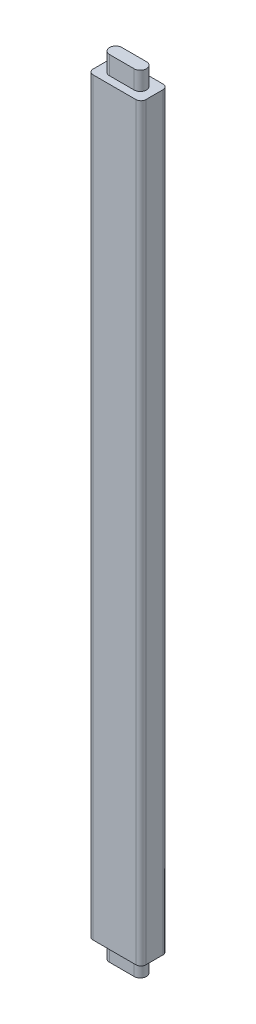
ISO-10303-21;
HEADER;
FILE_DESCRIPTION(('STEP AP214'),'2;1');
FILE_NAME('part.step','',(''),(''),'','','');
FILE_SCHEMA(('AUTOMOTIVE_DESIGN { 1 0 10303 214 1 1 1 1 }'));
ENDSEC;
DATA;
#1=APPLICATION_CONTEXT('core data for automotive mechanical design processes');
#2=APPLICATION_PROTOCOL_DEFINITION('international standard','automotive_design',2000,#1);
#3=PRODUCT_CONTEXT('',#1,'mechanical');
#4=PRODUCT('Part','Part','',(#3));
#5=PRODUCT_RELATED_PRODUCT_CATEGORY('part','',(#4));
#6=PRODUCT_DEFINITION_FORMATION('','',#4);
#7=PRODUCT_DEFINITION_CONTEXT('part definition',#1,'design');
#8=PRODUCT_DEFINITION('design','',#6,#7);
#9=PRODUCT_DEFINITION_SHAPE('','',#8);
#10=(LENGTH_UNIT() NAMED_UNIT(*) SI_UNIT(.MILLI.,.METRE.));
#11=(NAMED_UNIT(*) PLANE_ANGLE_UNIT() SI_UNIT($,.RADIAN.));
#12=(NAMED_UNIT(*) SI_UNIT($,.STERADIAN.) SOLID_ANGLE_UNIT());
#13=UNCERTAINTY_MEASURE_WITH_UNIT(LENGTH_MEASURE(1.E-05),#10,'distance_accuracy_value','');
#14=(GEOMETRIC_REPRESENTATION_CONTEXT(3) GLOBAL_UNCERTAINTY_ASSIGNED_CONTEXT((#13)) GLOBAL_UNIT_ASSIGNED_CONTEXT((#10,
#11,#12)) REPRESENTATION_CONTEXT('',''));
#15=CARTESIAN_POINT('',(0.,0.,0.));
#16=DIRECTION('',(0.,0.,1.));
#17=DIRECTION('',(1.,0.,0.));
#18=AXIS2_PLACEMENT_3D('',#15,#16,#17);
#19=CARTESIAN_POINT('',(0.,610.,0.));
#20=DIRECTION('',(0.,-1.,0.));
#21=DIRECTION('',(0.,0.,-1.));
#22=AXIS2_PLACEMENT_3D('',#19,#20,#21);
#23=PLANE('',#22);
#24=DIRECTION('',(1.,0.,0.));
#25=VECTOR('',#24,1.);
#26=CARTESIAN_POINT('',(0.,610.,0.));
#27=LINE('',#26,#25);
#28=CARTESIAN_POINT('',(4.,610.,0.));
#29=VERTEX_POINT('',#28);
#30=CARTESIAN_POINT('',(39.,610.,0.));
#31=VERTEX_POINT('',#30);
#32=EDGE_CURVE('E227',#29,#31,#27,.T.);
#33=ORIENTED_EDGE('',*,*,#32,.T.);
#34=CARTESIAN_POINT('',(39.,610.,-4.));
#35=DIRECTION('',(0.,-1.,0.));
#36=DIRECTION('',(0.,0.,-1.));
#37=AXIS2_PLACEMENT_3D('',#34,#35,#36);
#38=CIRCLE('',#37,4.);
#39=CARTESIAN_POINT('',(43.,610.,-4.));
#40=VERTEX_POINT('',#39);
#41=EDGE_CURVE('E267',#31,#40,#38,.F.);
#42=ORIENTED_EDGE('',*,*,#41,.T.);
#43=DIRECTION('',(0.,0.,-1.));
#44=VECTOR('',#43,1.);
#45=CARTESIAN_POINT('',(43.,610.,0.));
#46=LINE('',#45,#44);
#47=CARTESIAN_POINT('',(43.,610.,-18.));
#48=VERTEX_POINT('',#47);
#49=EDGE_CURVE('E231',#40,#48,#46,.T.);
#50=ORIENTED_EDGE('',*,*,#49,.T.);
#51=CARTESIAN_POINT('',(39.,610.,-18.));
#52=DIRECTION('',(0.,-1.,0.));
#53=DIRECTION('',(0.,0.,-1.));
#54=AXIS2_PLACEMENT_3D('',#51,#52,#53);
#55=CIRCLE('',#54,4.);
#56=CARTESIAN_POINT('',(39.,610.,-22.));
#57=VERTEX_POINT('',#56);
#58=EDGE_CURVE('E55',#48,#57,#55,.F.);
#59=ORIENTED_EDGE('',*,*,#58,.T.);
#60=DIRECTION('',(-1.,0.,0.));
#61=VECTOR('',#60,1.);
#62=CARTESIAN_POINT('',(0.,610.,-22.));
#63=LINE('',#62,#61);
#64=CARTESIAN_POINT('',(4.,610.,-22.));
#65=VERTEX_POINT('',#64);
#66=EDGE_CURVE('E233',#57,#65,#63,.T.);
#67=ORIENTED_EDGE('',*,*,#66,.T.);
#68=CARTESIAN_POINT('',(4.,610.,-18.));
#69=DIRECTION('',(0.,-1.,0.));
#70=DIRECTION('',(0.,0.,-1.));
#71=AXIS2_PLACEMENT_3D('',#68,#69,#70);
#72=CIRCLE('',#71,4.);
#73=CARTESIAN_POINT('',(0.,610.,-18.));
#74=VERTEX_POINT('',#73);
#75=EDGE_CURVE('E264',#65,#74,#72,.F.);
#76=ORIENTED_EDGE('',*,*,#75,.T.);
#77=DIRECTION('',(0.,0.,1.));
#78=VECTOR('',#77,1.);
#79=CARTESIAN_POINT('',(0.,610.,0.));
#80=LINE('',#79,#78);
#81=CARTESIAN_POINT('',(0.,610.,-4.));
#82=VERTEX_POINT('',#81);
#83=EDGE_CURVE('E224',#74,#82,#80,.T.);
#84=ORIENTED_EDGE('',*,*,#83,.T.);
#85=CARTESIAN_POINT('',(4.,610.,-4.));
#86=DIRECTION('',(0.,-1.,0.));
#87=DIRECTION('',(0.,0.,-1.));
#88=AXIS2_PLACEMENT_3D('',#85,#86,#87);
#89=CIRCLE('',#88,4.);
#90=EDGE_CURVE('E262',#82,#29,#89,.F.);
#91=ORIENTED_EDGE('',*,*,#90,.T.);
#92=EDGE_LOOP('',(#33,#42,#50,#59,#67,#76,#84,#91));
#93=FACE_BOUND('',#92,.T.);
#94=CARTESIAN_POINT('',(11.5,610.,-11.));
#95=DIRECTION('',(0.,1.,0.));
#96=DIRECTION('',(0.,0.,1.));
#97=AXIS2_PLACEMENT_3D('',#94,#95,#96);
#98=CIRCLE('',#97,5.);
#99=CARTESIAN_POINT('',(11.5,610.,-16.));
#100=VERTEX_POINT('',#99);
#101=CARTESIAN_POINT('',(11.5,610.,-6.));
#102=VERTEX_POINT('',#101);
#103=EDGE_CURVE('E186',#100,#102,#98,.T.);
#104=ORIENTED_EDGE('',*,*,#103,.F.);
#105=DIRECTION('',(-1.,0.,0.));
#106=VECTOR('',#105,1.);
#107=CARTESIAN_POINT('',(11.5,610.,-16.));
#108=LINE('',#107,#106);
#109=CARTESIAN_POINT('',(31.5,610.,-16.));
#110=VERTEX_POINT('',#109);
#111=EDGE_CURVE('E195',#110,#100,#108,.T.);
#112=ORIENTED_EDGE('',*,*,#111,.F.);
#113=CARTESIAN_POINT('',(31.5,610.,-11.));
#114=DIRECTION('',(0.,1.,0.));
#115=DIRECTION('',(0.,0.,1.));
#116=AXIS2_PLACEMENT_3D('',#113,#114,#115);
#117=CIRCLE('',#116,5.);
#118=CARTESIAN_POINT('',(31.5,610.,-6.00000000000001));
#119=VERTEX_POINT('',#118);
#120=EDGE_CURVE('E207',#119,#110,#117,.T.);
#121=ORIENTED_EDGE('',*,*,#120,.F.);
#122=DIRECTION('',(1.,0.,0.));
#123=VECTOR('',#122,1.);
#124=CARTESIAN_POINT('',(11.5,610.,-6.));
#125=LINE('',#124,#123);
#126=EDGE_CURVE('E204',#102,#119,#125,.T.);
#127=ORIENTED_EDGE('',*,*,#126,.F.);
#128=EDGE_LOOP('',(#104,#112,#121,#127));
#129=FACE_BOUND('',#128,.T.);
#130=ADVANCED_FACE('F33',(#93,#129),#23,.F.);
#131=CARTESIAN_POINT('',(0.,610.,0.));
#132=DIRECTION('',(1.,0.,0.));
#133=DIRECTION('',(0.,0.,-1.));
#134=AXIS2_PLACEMENT_3D('',#131,#132,#133);
#135=PLANE('',#134);
#136=ORIENTED_EDGE('',*,*,#83,.F.);
#137=DIRECTION('',(0.,-1.,0.));
#138=VECTOR('',#137,1.);
#139=CARTESIAN_POINT('',(0.,610.,-18.));
#140=LINE('',#139,#138);
#141=CARTESIAN_POINT('',(0.,0.,-18.));
#142=VERTEX_POINT('',#141);
#143=EDGE_CURVE('E11',#74,#142,#140,.T.);
#144=ORIENTED_EDGE('',*,*,#143,.T.);
#145=DIRECTION('',(0.,0.,1.));
#146=VECTOR('',#145,1.);
#147=CARTESIAN_POINT('',(0.,0.,0.));
#148=LINE('',#147,#146);
#149=CARTESIAN_POINT('',(0.,0.,-4.));
#150=VERTEX_POINT('',#149);
#151=EDGE_CURVE('E223',#142,#150,#148,.T.);
#152=ORIENTED_EDGE('',*,*,#151,.T.);
#153=DIRECTION('',(0.,-1.,0.));
#154=VECTOR('',#153,1.);
#155=CARTESIAN_POINT('',(0.,610.,-4.));
#156=LINE('',#155,#154);
#157=EDGE_CURVE('E41',#150,#82,#156,.F.);
#158=ORIENTED_EDGE('',*,*,#157,.T.);
#159=EDGE_LOOP('',(#136,#144,#152,#158));
#160=FACE_BOUND('',#159,.T.);
#161=ADVANCED_FACE('F275',(#160),#135,.F.);
#162=CARTESIAN_POINT('',(0.,610.,0.));
#163=DIRECTION('',(0.,0.,-1.));
#164=DIRECTION('',(-1.,0.,0.));
#165=AXIS2_PLACEMENT_3D('',#162,#163,#164);
#166=PLANE('',#165);
#167=DIRECTION('',(1.,0.,0.));
#168=VECTOR('',#167,1.);
#169=CARTESIAN_POINT('',(0.,0.,0.));
#170=LINE('',#169,#168);
#171=CARTESIAN_POINT('',(4.,0.,0.));
#172=VERTEX_POINT('',#171);
#173=CARTESIAN_POINT('',(39.,0.,0.));
#174=VERTEX_POINT('',#173);
#175=EDGE_CURVE('E238',#172,#174,#170,.T.);
#176=ORIENTED_EDGE('',*,*,#175,.T.);
#177=DIRECTION('',(0.,-1.,0.));
#178=VECTOR('',#177,1.);
#179=CARTESIAN_POINT('',(39.,610.,0.));
#180=LINE('',#179,#178);
#181=EDGE_CURVE('E260',#174,#31,#180,.F.);
#182=ORIENTED_EDGE('',*,*,#181,.T.);
#183=ORIENTED_EDGE('',*,*,#32,.F.);
#184=DIRECTION('',(0.,-1.,0.));
#185=VECTOR('',#184,1.);
#186=CARTESIAN_POINT('',(4.,610.,0.));
#187=LINE('',#186,#185);
#188=EDGE_CURVE('E257',#29,#172,#187,.T.);
#189=ORIENTED_EDGE('',*,*,#188,.T.);
#190=EDGE_LOOP('',(#176,#182,#183,#189));
#191=FACE_BOUND('',#190,.T.);
#192=ADVANCED_FACE('F286',(#191),#166,.F.);
#193=CARTESIAN_POINT('',(43.,610.,0.));
#194=DIRECTION('',(-1.,0.,0.));
#195=DIRECTION('',(0.,0.,1.));
#196=AXIS2_PLACEMENT_3D('',#193,#194,#195);
#197=PLANE('',#196);
#198=ORIENTED_EDGE('',*,*,#49,.F.);
#199=DIRECTION('',(0.,-1.,0.));
#200=VECTOR('',#199,1.);
#201=CARTESIAN_POINT('',(43.,610.,-4.));
#202=LINE('',#201,#200);
#203=CARTESIAN_POINT('',(43.,0.,-4.));
#204=VERTEX_POINT('',#203);
#205=EDGE_CURVE('E246',#40,#204,#202,.T.);
#206=ORIENTED_EDGE('',*,*,#205,.T.);
#207=DIRECTION('',(0.,0.,-1.));
#208=VECTOR('',#207,1.);
#209=CARTESIAN_POINT('',(43.,0.,0.));
#210=LINE('',#209,#208);
#211=CARTESIAN_POINT('',(43.,0.,-18.));
#212=VERTEX_POINT('',#211);
#213=EDGE_CURVE('E241',#204,#212,#210,.T.);
#214=ORIENTED_EDGE('',*,*,#213,.T.);
#215=DIRECTION('',(0.,-1.,0.));
#216=VECTOR('',#215,1.);
#217=CARTESIAN_POINT('',(43.,610.,-18.));
#218=LINE('',#217,#216);
#219=EDGE_CURVE('E235',#212,#48,#218,.F.);
#220=ORIENTED_EDGE('',*,*,#219,.T.);
#221=EDGE_LOOP('',(#198,#206,#214,#220));
#222=FACE_BOUND('',#221,.T.);
#223=ADVANCED_FACE('F297',(#222),#197,.F.);
#224=CARTESIAN_POINT('',(0.,610.,-22.));
#225=DIRECTION('',(0.,0.,1.));
#226=DIRECTION('',(1.,0.,0.));
#227=AXIS2_PLACEMENT_3D('',#224,#225,#226);
#228=PLANE('',#227);
#229=ORIENTED_EDGE('',*,*,#66,.F.);
#230=DIRECTION('',(0.,-1.,0.));
#231=VECTOR('',#230,1.);
#232=CARTESIAN_POINT('',(39.,610.,-22.));
#233=LINE('',#232,#231);
#234=CARTESIAN_POINT('',(39.,0.,-22.));
#235=VERTEX_POINT('',#234);
#236=EDGE_CURVE('E270',#57,#235,#233,.T.);
#237=ORIENTED_EDGE('',*,*,#236,.T.);
#238=DIRECTION('',(-1.,0.,0.));
#239=VECTOR('',#238,1.);
#240=CARTESIAN_POINT('',(0.,0.,-22.));
#241=LINE('',#240,#239);
#242=CARTESIAN_POINT('',(4.,0.,-22.));
#243=VERTEX_POINT('',#242);
#244=EDGE_CURVE('E228',#235,#243,#241,.T.);
#245=ORIENTED_EDGE('',*,*,#244,.T.);
#246=DIRECTION('',(0.,-1.,0.));
#247=VECTOR('',#246,1.);
#248=CARTESIAN_POINT('',(4.,610.,-22.));
#249=LINE('',#248,#247);
#250=EDGE_CURVE('E48',#243,#65,#249,.F.);
#251=ORIENTED_EDGE('',*,*,#250,.T.);
#252=EDGE_LOOP('',(#229,#237,#245,#251));
#253=FACE_BOUND('',#252,.T.);
#254=ADVANCED_FACE('F303',(#253),#228,.F.);
#255=CARTESIAN_POINT('',(0.,0.,0.));
#256=DIRECTION('',(0.,-1.,0.));
#257=DIRECTION('',(0.,0.,-1.));
#258=AXIS2_PLACEMENT_3D('',#255,#256,#257);
#259=PLANE('',#258);
#260=CARTESIAN_POINT('',(11.5,0.,-11.));
#261=DIRECTION('',(0.,1.,0.));
#262=DIRECTION('',(0.,0.,1.));
#263=AXIS2_PLACEMENT_3D('',#260,#261,#262);
#264=CIRCLE('',#263,5.);
#265=CARTESIAN_POINT('',(11.5,0.,-16.));
#266=VERTEX_POINT('',#265);
#267=CARTESIAN_POINT('',(11.5,0.,-6.));
#268=VERTEX_POINT('',#267);
#269=EDGE_CURVE('E181',#266,#268,#264,.T.);
#270=ORIENTED_EDGE('',*,*,#269,.T.);
#271=DIRECTION('',(1.,0.,0.));
#272=VECTOR('',#271,1.);
#273=CARTESIAN_POINT('',(11.5,0.,-6.));
#274=LINE('',#273,#272);
#275=CARTESIAN_POINT('',(31.5,0.,-6.));
#276=VERTEX_POINT('',#275);
#277=EDGE_CURVE('E154',#268,#276,#274,.T.);
#278=ORIENTED_EDGE('',*,*,#277,.T.);
#279=CARTESIAN_POINT('',(31.5,0.,-11.));
#280=DIRECTION('',(0.,1.,0.));
#281=DIRECTION('',(0.,0.,1.));
#282=AXIS2_PLACEMENT_3D('',#279,#280,#281);
#283=CIRCLE('',#282,5.);
#284=CARTESIAN_POINT('',(31.5,0.,-16.));
#285=VERTEX_POINT('',#284);
#286=EDGE_CURVE('E176',#276,#285,#283,.T.);
#287=ORIENTED_EDGE('',*,*,#286,.T.);
#288=DIRECTION('',(-1.,0.,0.));
#289=VECTOR('',#288,1.);
#290=CARTESIAN_POINT('',(11.5,0.,-16.));
#291=LINE('',#290,#289);
#292=EDGE_CURVE('E174',#285,#266,#291,.T.);
#293=ORIENTED_EDGE('',*,*,#292,.T.);
#294=EDGE_LOOP('',(#270,#278,#287,#293));
#295=FACE_BOUND('',#294,.T.);
#296=ORIENTED_EDGE('',*,*,#213,.F.);
#297=CARTESIAN_POINT('',(39.,0.,-4.));
#298=DIRECTION('',(0.,-1.,0.));
#299=DIRECTION('',(0.,0.,-1.));
#300=AXIS2_PLACEMENT_3D('',#297,#298,#299);
#301=CIRCLE('',#300,4.);
#302=EDGE_CURVE('E255',#204,#174,#301,.T.);
#303=ORIENTED_EDGE('',*,*,#302,.T.);
#304=ORIENTED_EDGE('',*,*,#175,.F.);
#305=CARTESIAN_POINT('',(4.,0.,-4.));
#306=DIRECTION('',(0.,-1.,0.));
#307=DIRECTION('',(0.,0.,-1.));
#308=AXIS2_PLACEMENT_3D('',#305,#306,#307);
#309=CIRCLE('',#308,4.);
#310=EDGE_CURVE('E249',#172,#150,#309,.T.);
#311=ORIENTED_EDGE('',*,*,#310,.T.);
#312=ORIENTED_EDGE('',*,*,#151,.F.);
#313=CARTESIAN_POINT('',(4.,0.,-18.));
#314=DIRECTION('',(0.,-1.,0.));
#315=DIRECTION('',(0.,0.,-1.));
#316=AXIS2_PLACEMENT_3D('',#313,#314,#315);
#317=CIRCLE('',#316,4.);
#318=EDGE_CURVE('E251',#142,#243,#317,.T.);
#319=ORIENTED_EDGE('',*,*,#318,.T.);
#320=ORIENTED_EDGE('',*,*,#244,.F.);
#321=CARTESIAN_POINT('',(39.,0.,-18.));
#322=DIRECTION('',(0.,-1.,0.));
#323=DIRECTION('',(0.,0.,-1.));
#324=AXIS2_PLACEMENT_3D('',#321,#322,#323);
#325=CIRCLE('',#324,4.);
#326=EDGE_CURVE('E253',#235,#212,#325,.T.);
#327=ORIENTED_EDGE('',*,*,#326,.T.);
#328=EDGE_LOOP('',(#296,#303,#304,#311,#312,#319,#320,#327));
#329=FACE_BOUND('',#328,.T.);
#330=ADVANCED_FACE('F290',(#295,#329),#259,.T.);
#331=CARTESIAN_POINT('',(11.5,625.,-11.));
#332=DIRECTION('',(0.,-1.,0.));
#333=DIRECTION('',(0.,0.,-1.));
#334=AXIS2_PLACEMENT_3D('',#331,#332,#333);
#335=CYLINDRICAL_SURFACE('',#334,5.);
#336=ORIENTED_EDGE('',*,*,#103,.T.);
#337=DIRECTION('',(0.,-1.,0.));
#338=VECTOR('',#337,1.);
#339=CARTESIAN_POINT('',(11.5,625.,-6.));
#340=LINE('',#339,#338);
#341=CARTESIAN_POINT('',(11.5,625.,-6.));
#342=VERTEX_POINT('',#341);
#343=EDGE_CURVE('E220',#342,#102,#340,.T.);
#344=ORIENTED_EDGE('',*,*,#343,.F.);
#345=CARTESIAN_POINT('',(11.5,625.,-11.));
#346=DIRECTION('',(0.,1.,0.));
#347=DIRECTION('',(0.,0.,1.));
#348=AXIS2_PLACEMENT_3D('',#345,#346,#347);
#349=CIRCLE('',#348,5.);
#350=CARTESIAN_POINT('',(11.5,625.,-16.));
#351=VERTEX_POINT('',#350);
#352=EDGE_CURVE('E191',#351,#342,#349,.T.);
#353=ORIENTED_EDGE('',*,*,#352,.F.);
#354=DIRECTION('',(0.,-1.,0.));
#355=VECTOR('',#354,1.);
#356=CARTESIAN_POINT('',(11.5,625.,-16.));
#357=LINE('',#356,#355);
#358=EDGE_CURVE('E201',#351,#100,#357,.T.);
#359=ORIENTED_EDGE('',*,*,#358,.T.);
#360=EDGE_LOOP('',(#336,#344,#353,#359));
#361=FACE_BOUND('',#360,.T.);
#362=ADVANCED_FACE('F320',(#361),#335,.T.);
#363=CARTESIAN_POINT('',(11.5,625.,-6.));
#364=DIRECTION('',(0.,0.,-1.));
#365=DIRECTION('',(-1.,0.,0.));
#366=AXIS2_PLACEMENT_3D('',#363,#364,#365);
#367=PLANE('',#366);
#368=ORIENTED_EDGE('',*,*,#126,.T.);
#369=DIRECTION('',(0.,-1.,0.));
#370=VECTOR('',#369,1.);
#371=CARTESIAN_POINT('',(31.5,625.,-6.00000000000001));
#372=LINE('',#371,#370);
#373=CARTESIAN_POINT('',(31.5,625.,-6.00000000000001));
#374=VERTEX_POINT('',#373);
#375=EDGE_CURVE('E217',#374,#119,#372,.T.);
#376=ORIENTED_EDGE('',*,*,#375,.F.);
#377=DIRECTION('',(1.,0.,0.));
#378=VECTOR('',#377,1.);
#379=CARTESIAN_POINT('',(11.5,625.,-6.));
#380=LINE('',#379,#378);
#381=EDGE_CURVE('E194',#342,#374,#380,.T.);
#382=ORIENTED_EDGE('',*,*,#381,.F.);
#383=ORIENTED_EDGE('',*,*,#343,.T.);
#384=EDGE_LOOP('',(#368,#376,#382,#383));
#385=FACE_BOUND('',#384,.T.);
#386=ADVANCED_FACE('F361',(#385),#367,.F.);
#387=CARTESIAN_POINT('',(31.5,625.,-11.));
#388=DIRECTION('',(0.,-1.,0.));
#389=DIRECTION('',(0.,0.,-1.));
#390=AXIS2_PLACEMENT_3D('',#387,#388,#389);
#391=CYLINDRICAL_SURFACE('',#390,5.);
#392=ORIENTED_EDGE('',*,*,#120,.T.);
#393=DIRECTION('',(0.,-1.,0.));
#394=VECTOR('',#393,1.);
#395=CARTESIAN_POINT('',(31.5,625.,-16.));
#396=LINE('',#395,#394);
#397=CARTESIAN_POINT('',(31.5,625.,-16.));
#398=VERTEX_POINT('',#397);
#399=EDGE_CURVE('E214',#398,#110,#396,.T.);
#400=ORIENTED_EDGE('',*,*,#399,.F.);
#401=CARTESIAN_POINT('',(31.5,625.,-11.));
#402=DIRECTION('',(0.,1.,0.));
#403=DIRECTION('',(0.,0.,1.));
#404=AXIS2_PLACEMENT_3D('',#401,#402,#403);
#405=CIRCLE('',#404,5.);
#406=EDGE_CURVE('E197',#374,#398,#405,.T.);
#407=ORIENTED_EDGE('',*,*,#406,.F.);
#408=ORIENTED_EDGE('',*,*,#375,.T.);
#409=EDGE_LOOP('',(#392,#400,#407,#408));
#410=FACE_BOUND('',#409,.T.);
#411=ADVANCED_FACE('F358',(#410),#391,.T.);
#412=CARTESIAN_POINT('',(11.5,625.,-16.));
#413=DIRECTION('',(0.,0.,1.));
#414=DIRECTION('',(1.,0.,0.));
#415=AXIS2_PLACEMENT_3D('',#412,#413,#414);
#416=PLANE('',#415);
#417=ORIENTED_EDGE('',*,*,#111,.T.);
#418=ORIENTED_EDGE('',*,*,#358,.F.);
#419=DIRECTION('',(-1.,0.,0.));
#420=VECTOR('',#419,1.);
#421=CARTESIAN_POINT('',(11.5,625.,-16.));
#422=LINE('',#421,#420);
#423=EDGE_CURVE('E199',#398,#351,#422,.T.);
#424=ORIENTED_EDGE('',*,*,#423,.F.);
#425=ORIENTED_EDGE('',*,*,#399,.T.);
#426=EDGE_LOOP('',(#417,#418,#424,#425));
#427=FACE_BOUND('',#426,.T.);
#428=ADVANCED_FACE('F354',(#427),#416,.F.);
#429=CARTESIAN_POINT('',(11.5,625.,-11.));
#430=DIRECTION('',(0.,1.,0.));
#431=DIRECTION('',(0.,0.,1.));
#432=AXIS2_PLACEMENT_3D('',#429,#430,#431);
#433=PLANE('',#432);
#434=ORIENTED_EDGE('',*,*,#352,.T.);
#435=ORIENTED_EDGE('',*,*,#381,.T.);
#436=ORIENTED_EDGE('',*,*,#406,.T.);
#437=ORIENTED_EDGE('',*,*,#423,.T.);
#438=EDGE_LOOP('',(#434,#435,#436,#437));
#439=FACE_BOUND('',#438,.T.);
#440=ADVANCED_FACE('F351',(#439),#433,.T.);
#441=CARTESIAN_POINT('',(11.5,-15.,-11.));
#442=DIRECTION('',(0.,1.,0.));
#443=DIRECTION('',(0.,0.,1.));
#444=AXIS2_PLACEMENT_3D('',#441,#442,#443);
#445=CYLINDRICAL_SURFACE('',#444,5.);
#446=ORIENTED_EDGE('',*,*,#269,.F.);
#447=DIRECTION('',(0.,1.,0.));
#448=VECTOR('',#447,1.);
#449=CARTESIAN_POINT('',(11.5,-15.,-16.));
#450=LINE('',#449,#448);
#451=CARTESIAN_POINT('',(11.5,-15.,-16.));
#452=VERTEX_POINT('',#451);
#453=EDGE_CURVE('E173',#452,#266,#450,.T.);
#454=ORIENTED_EDGE('',*,*,#453,.F.);
#455=CARTESIAN_POINT('',(11.5,-15.,-11.));
#456=DIRECTION('',(0.,1.,0.));
#457=DIRECTION('',(0.,0.,1.));
#458=AXIS2_PLACEMENT_3D('',#455,#456,#457);
#459=CIRCLE('',#458,5.);
#460=CARTESIAN_POINT('',(11.5,-15.,-6.));
#461=VERTEX_POINT('',#460);
#462=EDGE_CURVE('E166',#452,#461,#459,.T.);
#463=ORIENTED_EDGE('',*,*,#462,.T.);
#464=DIRECTION('',(0.,1.,0.));
#465=VECTOR('',#464,1.);
#466=CARTESIAN_POINT('',(11.5,-15.,-6.));
#467=LINE('',#466,#465);
#468=EDGE_CURVE('E149',#461,#268,#467,.T.);
#469=ORIENTED_EDGE('',*,*,#468,.T.);
#470=EDGE_LOOP('',(#446,#454,#463,#469));
#471=FACE_BOUND('',#470,.T.);
#472=ADVANCED_FACE('F171',(#471),#445,.T.);
#473=CARTESIAN_POINT('',(11.5,-15.,-16.));
#474=DIRECTION('',(0.,0.,-1.));
#475=DIRECTION('',(-1.,0.,0.));
#476=AXIS2_PLACEMENT_3D('',#473,#474,#475);
#477=PLANE('',#476);
#478=ORIENTED_EDGE('',*,*,#292,.F.);
#479=DIRECTION('',(0.,1.,0.));
#480=VECTOR('',#479,1.);
#481=CARTESIAN_POINT('',(31.5,-15.,-16.));
#482=LINE('',#481,#480);
#483=CARTESIAN_POINT('',(31.5,-15.,-16.));
#484=VERTEX_POINT('',#483);
#485=EDGE_CURVE('E187',#484,#285,#482,.T.);
#486=ORIENTED_EDGE('',*,*,#485,.F.);
#487=DIRECTION('',(-1.,0.,0.));
#488=VECTOR('',#487,1.);
#489=CARTESIAN_POINT('',(11.5,-15.,-16.));
#490=LINE('',#489,#488);
#491=EDGE_CURVE('E159',#484,#452,#490,.T.);
#492=ORIENTED_EDGE('',*,*,#491,.T.);
#493=ORIENTED_EDGE('',*,*,#453,.T.);
#494=EDGE_LOOP('',(#478,#486,#492,#493));
#495=FACE_BOUND('',#494,.T.);
#496=ADVANCED_FACE('F342',(#495),#477,.T.);
#497=CARTESIAN_POINT('',(31.5,-15.,-11.));
#498=DIRECTION('',(0.,1.,0.));
#499=DIRECTION('',(0.,0.,1.));
#500=AXIS2_PLACEMENT_3D('',#497,#498,#499);
#501=CYLINDRICAL_SURFACE('',#500,5.);
#502=ORIENTED_EDGE('',*,*,#286,.F.);
#503=DIRECTION('',(0.,1.,0.));
#504=VECTOR('',#503,1.);
#505=CARTESIAN_POINT('',(31.5,-15.,-6.00000000000001));
#506=LINE('',#505,#504);
#507=CARTESIAN_POINT('',(31.5,-15.,-6.00000000000001));
#508=VERTEX_POINT('',#507);
#509=EDGE_CURVE('E158',#508,#276,#506,.T.);
#510=ORIENTED_EDGE('',*,*,#509,.F.);
#511=CARTESIAN_POINT('',(31.5,-15.,-11.));
#512=DIRECTION('',(0.,1.,0.));
#513=DIRECTION('',(0.,0.,1.));
#514=AXIS2_PLACEMENT_3D('',#511,#512,#513);
#515=CIRCLE('',#514,5.);
#516=EDGE_CURVE('E169',#508,#484,#515,.T.);
#517=ORIENTED_EDGE('',*,*,#516,.T.);
#518=ORIENTED_EDGE('',*,*,#485,.T.);
#519=EDGE_LOOP('',(#502,#510,#517,#518));
#520=FACE_BOUND('',#519,.T.);
#521=ADVANCED_FACE('F339',(#520),#501,.T.);
#522=CARTESIAN_POINT('',(11.5,-15.,-6.));
#523=DIRECTION('',(0.,0.,1.));
#524=DIRECTION('',(1.,0.,0.));
#525=AXIS2_PLACEMENT_3D('',#522,#523,#524);
#526=PLANE('',#525);
#527=ORIENTED_EDGE('',*,*,#277,.F.);
#528=ORIENTED_EDGE('',*,*,#468,.F.);
#529=DIRECTION('',(1.,0.,0.));
#530=VECTOR('',#529,1.);
#531=CARTESIAN_POINT('',(11.5,-15.,-6.));
#532=LINE('',#531,#530);
#533=EDGE_CURVE('E153',#461,#508,#532,.T.);
#534=ORIENTED_EDGE('',*,*,#533,.T.);
#535=ORIENTED_EDGE('',*,*,#509,.T.);
#536=EDGE_LOOP('',(#527,#528,#534,#535));
#537=FACE_BOUND('',#536,.T.);
#538=ADVANCED_FACE('F151',(#537),#526,.T.);
#539=CARTESIAN_POINT('',(11.5,-15.,-11.));
#540=DIRECTION('',(0.,1.,0.));
#541=DIRECTION('',(0.,0.,1.));
#542=AXIS2_PLACEMENT_3D('',#539,#540,#541);
#543=PLANE('',#542);
#544=ORIENTED_EDGE('',*,*,#462,.F.);
#545=ORIENTED_EDGE('',*,*,#491,.F.);
#546=ORIENTED_EDGE('',*,*,#516,.F.);
#547=ORIENTED_EDGE('',*,*,#533,.F.);
#548=EDGE_LOOP('',(#544,#545,#546,#547));
#549=FACE_BOUND('',#548,.T.);
#550=ADVANCED_FACE('F164',(#549),#543,.F.);
#551=CARTESIAN_POINT('',(39.,610.,-4.));
#552=DIRECTION('',(0.,-1.,0.));
#553=DIRECTION('',(0.,0.,-1.));
#554=AXIS2_PLACEMENT_3D('',#551,#552,#553);
#555=CYLINDRICAL_SURFACE('',#554,4.);
#556=ORIENTED_EDGE('',*,*,#41,.F.);
#557=ORIENTED_EDGE('',*,*,#181,.F.);
#558=ORIENTED_EDGE('',*,*,#302,.F.);
#559=ORIENTED_EDGE('',*,*,#205,.F.);
#560=EDGE_LOOP('',(#556,#557,#558,#559));
#561=FACE_BOUND('',#560,.T.);
#562=ADVANCED_FACE('F294',(#561),#555,.T.);
#563=CARTESIAN_POINT('',(39.,610.,-18.));
#564=DIRECTION('',(0.,-1.,0.));
#565=DIRECTION('',(0.,0.,-1.));
#566=AXIS2_PLACEMENT_3D('',#563,#564,#565);
#567=CYLINDRICAL_SURFACE('',#566,4.);
#568=ORIENTED_EDGE('',*,*,#58,.F.);
#569=ORIENTED_EDGE('',*,*,#219,.F.);
#570=ORIENTED_EDGE('',*,*,#326,.F.);
#571=ORIENTED_EDGE('',*,*,#236,.F.);
#572=EDGE_LOOP('',(#568,#569,#570,#571));
#573=FACE_BOUND('',#572,.T.);
#574=ADVANCED_FACE('F301',(#573),#567,.T.);
#575=CARTESIAN_POINT('',(4.,610.,-18.));
#576=DIRECTION('',(0.,-1.,0.));
#577=DIRECTION('',(0.,0.,-1.));
#578=AXIS2_PLACEMENT_3D('',#575,#576,#577);
#579=CYLINDRICAL_SURFACE('',#578,4.);
#580=ORIENTED_EDGE('',*,*,#75,.F.);
#581=ORIENTED_EDGE('',*,*,#250,.F.);
#582=ORIENTED_EDGE('',*,*,#318,.F.);
#583=ORIENTED_EDGE('',*,*,#143,.F.);
#584=EDGE_LOOP('',(#580,#581,#582,#583));
#585=FACE_BOUND('',#584,.T.);
#586=ADVANCED_FACE('F305',(#585),#579,.T.);
#587=CARTESIAN_POINT('',(4.,610.,-4.));
#588=DIRECTION('',(0.,-1.,0.));
#589=DIRECTION('',(0.,0.,-1.));
#590=AXIS2_PLACEMENT_3D('',#587,#588,#589);
#591=CYLINDRICAL_SURFACE('',#590,4.);
#592=ORIENTED_EDGE('',*,*,#90,.F.);
#593=ORIENTED_EDGE('',*,*,#157,.F.);
#594=ORIENTED_EDGE('',*,*,#310,.F.);
#595=ORIENTED_EDGE('',*,*,#188,.F.);
#596=EDGE_LOOP('',(#592,#593,#594,#595));
#597=FACE_BOUND('',#596,.T.);
#598=ADVANCED_FACE('F35',(#597),#591,.T.);
#599=CLOSED_SHELL('',(#130,#161,#192,#223,#254,#330,#362,#386,#411,#428,#440,#472,#496,#521,
#538,#550,#562,#574,#586,#598));
#600=MANIFOLD_SOLID_BREP('B2',#599);
#601=ADVANCED_BREP_SHAPE_REPRESENTATION('',(#18,#600),#14);
#602=SHAPE_DEFINITION_REPRESENTATION(#9,#601);
ENDSEC;
END-ISO-10303-21;
